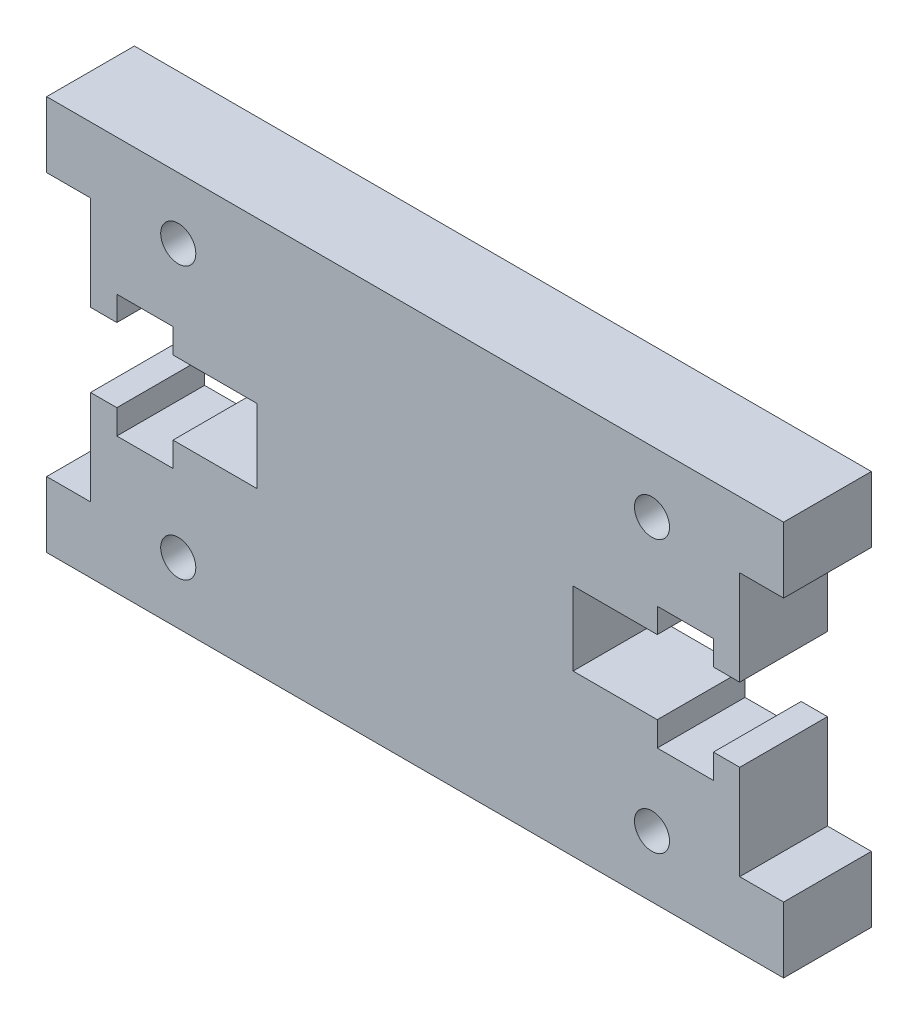
ISO-10303-21;
HEADER;
FILE_DESCRIPTION(('STEP AP214'),'2;1');
FILE_NAME('part.step','',(''),(''),'','','');
FILE_SCHEMA(('AUTOMOTIVE_DESIGN { 1 0 10303 214 1 1 1 1 }'));
ENDSEC;
DATA;
#1=APPLICATION_CONTEXT('core data for automotive mechanical design processes');
#2=APPLICATION_PROTOCOL_DEFINITION('international standard','automotive_design',2000,#1);
#3=PRODUCT_CONTEXT('',#1,'mechanical');
#4=PRODUCT('Part','Part','',(#3));
#5=PRODUCT_RELATED_PRODUCT_CATEGORY('part','',(#4));
#6=PRODUCT_DEFINITION_FORMATION('','',#4);
#7=PRODUCT_DEFINITION_CONTEXT('part definition',#1,'design');
#8=PRODUCT_DEFINITION('design','',#6,#7);
#9=PRODUCT_DEFINITION_SHAPE('','',#8);
#10=(LENGTH_UNIT() NAMED_UNIT(*) SI_UNIT(.MILLI.,.METRE.));
#11=(NAMED_UNIT(*) PLANE_ANGLE_UNIT() SI_UNIT($,.RADIAN.));
#12=(NAMED_UNIT(*) SI_UNIT($,.STERADIAN.) SOLID_ANGLE_UNIT());
#13=UNCERTAINTY_MEASURE_WITH_UNIT(LENGTH_MEASURE(1.E-05),#10,'distance_accuracy_value','');
#14=(GEOMETRIC_REPRESENTATION_CONTEXT(3) GLOBAL_UNCERTAINTY_ASSIGNED_CONTEXT((#13)) GLOBAL_UNIT_ASSIGNED_CONTEXT((#10,
#11,#12)) REPRESENTATION_CONTEXT('',''));
#15=CARTESIAN_POINT('',(0.,0.,0.));
#16=DIRECTION('',(0.,0.,1.));
#17=DIRECTION('',(1.,0.,0.));
#18=AXIS2_PLACEMENT_3D('',#15,#16,#17);
#19=CARTESIAN_POINT('',(0.,18.75,5.));
#20=DIRECTION('',(0.,-1.,0.));
#21=DIRECTION('',(1.,0.,0.));
#22=AXIS2_PLACEMENT_3D('',#19,#20,#21);
#23=PLANE('',#22);
#24=DIRECTION('',(-1.,0.,0.));
#25=VECTOR('',#24,1.);
#26=CARTESIAN_POINT('',(0.,18.75,0.));
#27=LINE('',#26,#25);
#28=CARTESIAN_POINT('',(0.,18.75,0.));
#29=VERTEX_POINT('',#28);
#30=CARTESIAN_POINT('',(-2.5,18.75,0.));
#31=VERTEX_POINT('',#30);
#32=EDGE_CURVE('E484',#29,#31,#27,.T.);
#33=ORIENTED_EDGE('',*,*,#32,.F.);
#34=DIRECTION('',(0.,0.,-1.));
#35=VECTOR('',#34,1.);
#36=CARTESIAN_POINT('',(0.,18.75,5.));
#37=LINE('',#36,#35);
#38=CARTESIAN_POINT('',(0.,18.75,5.));
#39=VERTEX_POINT('',#38);
#40=EDGE_CURVE('E11',#39,#29,#37,.T.);
#41=ORIENTED_EDGE('',*,*,#40,.F.);
#42=DIRECTION('',(-1.,0.,0.));
#43=VECTOR('',#42,1.);
#44=CARTESIAN_POINT('',(0.,18.75,5.));
#45=LINE('',#44,#43);
#46=CARTESIAN_POINT('',(-2.5,18.75,5.));
#47=VERTEX_POINT('',#46);
#48=EDGE_CURVE('E375',#39,#47,#45,.T.);
#49=ORIENTED_EDGE('',*,*,#48,.T.);
#50=DIRECTION('',(0.,0.,-1.));
#51=VECTOR('',#50,1.);
#52=CARTESIAN_POINT('',(-2.5,18.75,5.));
#53=LINE('',#52,#51);
#54=EDGE_CURVE('E56',#47,#31,#53,.T.);
#55=ORIENTED_EDGE('',*,*,#54,.T.);
#56=EDGE_LOOP('',(#33,#41,#49,#55));
#57=FACE_BOUND('',#56,.T.);
#58=ADVANCED_FACE('F39',(#57),#23,.T.);
#59=CARTESIAN_POINT('',(0.,0.,5.));
#60=DIRECTION('',(-1.,0.,0.));
#61=DIRECTION('',(0.,0.,1.));
#62=AXIS2_PLACEMENT_3D('',#59,#60,#61);
#63=PLANE('',#62);
#64=DIRECTION('',(0.,1.,0.));
#65=VECTOR('',#64,1.);
#66=CARTESIAN_POINT('',(0.,0.,0.));
#67=LINE('',#66,#65);
#68=CARTESIAN_POINT('',(0.,22.5,0.));
#69=VERTEX_POINT('',#68);
#70=EDGE_CURVE('E481',#29,#69,#67,.T.);
#71=ORIENTED_EDGE('',*,*,#70,.T.);
#72=DIRECTION('',(0.,0.,-1.));
#73=VECTOR('',#72,1.);
#74=CARTESIAN_POINT('',(0.,22.5,5.));
#75=LINE('',#74,#73);
#76=CARTESIAN_POINT('',(0.,22.5,5.));
#77=VERTEX_POINT('',#76);
#78=EDGE_CURVE('E48',#77,#69,#75,.T.);
#79=ORIENTED_EDGE('',*,*,#78,.F.);
#80=DIRECTION('',(0.,1.,0.));
#81=VECTOR('',#80,1.);
#82=CARTESIAN_POINT('',(0.,0.,5.));
#83=LINE('',#82,#81);
#84=EDGE_CURVE('E372',#39,#77,#83,.T.);
#85=ORIENTED_EDGE('',*,*,#84,.F.);
#86=ORIENTED_EDGE('',*,*,#40,.T.);
#87=EDGE_LOOP('',(#71,#79,#85,#86));
#88=FACE_BOUND('',#87,.T.);
#89=ADVANCED_FACE('F482',(#88),#63,.F.);
#90=CARTESIAN_POINT('',(0.,22.5,5.));
#91=DIRECTION('',(0.,-1.,0.));
#92=DIRECTION('',(1.,0.,0.));
#93=AXIS2_PLACEMENT_3D('',#90,#91,#92);
#94=PLANE('',#93);
#95=DIRECTION('',(-1.,0.,0.));
#96=VECTOR('',#95,1.);
#97=CARTESIAN_POINT('',(0.,22.5,0.));
#98=LINE('',#97,#96);
#99=CARTESIAN_POINT('',(-42.,22.5,0.));
#100=VERTEX_POINT('',#99);
#101=EDGE_CURVE('E477',#69,#100,#98,.T.);
#102=ORIENTED_EDGE('',*,*,#101,.T.);
#103=DIRECTION('',(0.,0.,-1.));
#104=VECTOR('',#103,1.);
#105=CARTESIAN_POINT('',(-42.,22.5,5.));
#106=LINE('',#105,#104);
#107=CARTESIAN_POINT('',(-42.,22.5,5.));
#108=VERTEX_POINT('',#107);
#109=EDGE_CURVE('E469',#108,#100,#106,.T.);
#110=ORIENTED_EDGE('',*,*,#109,.F.);
#111=DIRECTION('',(-1.,0.,0.));
#112=VECTOR('',#111,1.);
#113=CARTESIAN_POINT('',(0.,22.5,5.));
#114=LINE('',#113,#112);
#115=EDGE_CURVE('E370',#77,#108,#114,.T.);
#116=ORIENTED_EDGE('',*,*,#115,.F.);
#117=ORIENTED_EDGE('',*,*,#78,.T.);
#118=EDGE_LOOP('',(#102,#110,#116,#117));
#119=FACE_BOUND('',#118,.T.);
#120=ADVANCED_FACE('F475',(#119),#94,.F.);
#121=CARTESIAN_POINT('',(-42.,0.,5.));
#122=DIRECTION('',(-1.,0.,0.));
#123=DIRECTION('',(0.,0.,1.));
#124=AXIS2_PLACEMENT_3D('',#121,#122,#123);
#125=PLANE('',#124);
#126=DIRECTION('',(0.,1.,0.));
#127=VECTOR('',#126,1.);
#128=CARTESIAN_POINT('',(-42.,0.,0.));
#129=LINE('',#128,#127);
#130=CARTESIAN_POINT('',(-42.,18.75,0.));
#131=VERTEX_POINT('',#130);
#132=EDGE_CURVE('E487',#131,#100,#129,.T.);
#133=ORIENTED_EDGE('',*,*,#132,.F.);
#134=DIRECTION('',(0.,0.,-1.));
#135=VECTOR('',#134,1.);
#136=CARTESIAN_POINT('',(-42.,18.75,5.));
#137=LINE('',#136,#135);
#138=CARTESIAN_POINT('',(-42.,18.75,5.));
#139=VERTEX_POINT('',#138);
#140=EDGE_CURVE('E467',#139,#131,#137,.T.);
#141=ORIENTED_EDGE('',*,*,#140,.F.);
#142=DIRECTION('',(0.,1.,0.));
#143=VECTOR('',#142,1.);
#144=CARTESIAN_POINT('',(-42.,0.,5.));
#145=LINE('',#144,#143);
#146=EDGE_CURVE('E367',#139,#108,#145,.T.);
#147=ORIENTED_EDGE('',*,*,#146,.T.);
#148=ORIENTED_EDGE('',*,*,#109,.T.);
#149=EDGE_LOOP('',(#133,#141,#147,#148));
#150=FACE_BOUND('',#149,.T.);
#151=ADVANCED_FACE('F614',(#150),#125,.T.);
#152=CARTESIAN_POINT('',(0.,18.7500000000001,5.));
#153=DIRECTION('',(0.,1.,0.));
#154=DIRECTION('',(-1.,0.,0.));
#155=AXIS2_PLACEMENT_3D('',#152,#153,#154);
#156=PLANE('',#155);
#157=DIRECTION('',(1.,0.,0.));
#158=VECTOR('',#157,1.);
#159=CARTESIAN_POINT('',(0.,18.7500000000001,0.));
#160=LINE('',#159,#158);
#161=CARTESIAN_POINT('',(-39.5,18.75,0.));
#162=VERTEX_POINT('',#161);
#163=EDGE_CURVE('E602',#131,#162,#160,.T.);
#164=ORIENTED_EDGE('',*,*,#163,.T.);
#165=DIRECTION('',(0.,0.,-1.));
#166=VECTOR('',#165,1.);
#167=CARTESIAN_POINT('',(-39.5,18.75,5.));
#168=LINE('',#167,#166);
#169=CARTESIAN_POINT('',(-39.5,18.75,5.));
#170=VERTEX_POINT('',#169);
#171=EDGE_CURVE('E464',#170,#162,#168,.T.);
#172=ORIENTED_EDGE('',*,*,#171,.F.);
#173=DIRECTION('',(1.,0.,0.));
#174=VECTOR('',#173,1.);
#175=CARTESIAN_POINT('',(0.,18.7500000000001,5.));
#176=LINE('',#175,#174);
#177=EDGE_CURVE('E364',#139,#170,#176,.T.);
#178=ORIENTED_EDGE('',*,*,#177,.F.);
#179=ORIENTED_EDGE('',*,*,#140,.T.);
#180=EDGE_LOOP('',(#164,#172,#178,#179));
#181=FACE_BOUND('',#180,.T.);
#182=ADVANCED_FACE('F724',(#181),#156,.F.);
#183=CARTESIAN_POINT('',(-39.5,0.,5.));
#184=DIRECTION('',(1.,0.,0.));
#185=DIRECTION('',(0.,1.,0.));
#186=AXIS2_PLACEMENT_3D('',#183,#184,#185);
#187=PLANE('',#186);
#188=DIRECTION('',(0.,-1.,0.));
#189=VECTOR('',#188,1.);
#190=CARTESIAN_POINT('',(-39.5,0.,0.));
#191=LINE('',#190,#189);
#192=CARTESIAN_POINT('',(-39.5,13.35,0.));
#193=VERTEX_POINT('',#192);
#194=EDGE_CURVE('E592',#162,#193,#191,.T.);
#195=ORIENTED_EDGE('',*,*,#194,.T.);
#196=DIRECTION('',(0.,0.,-1.));
#197=VECTOR('',#196,1.);
#198=CARTESIAN_POINT('',(-39.5,13.35,5.));
#199=LINE('',#198,#197);
#200=CARTESIAN_POINT('',(-39.5,13.35,5.));
#201=VERTEX_POINT('',#200);
#202=EDGE_CURVE('E461',#201,#193,#199,.T.);
#203=ORIENTED_EDGE('',*,*,#202,.F.);
#204=DIRECTION('',(0.,-1.,0.));
#205=VECTOR('',#204,1.);
#206=CARTESIAN_POINT('',(-39.5,0.,5.));
#207=LINE('',#206,#205);
#208=EDGE_CURVE('E361',#170,#201,#207,.T.);
#209=ORIENTED_EDGE('',*,*,#208,.F.);
#210=ORIENTED_EDGE('',*,*,#171,.T.);
#211=EDGE_LOOP('',(#195,#203,#209,#210));
#212=FACE_BOUND('',#211,.T.);
#213=ADVANCED_FACE('F693',(#212),#187,.F.);
#214=CARTESIAN_POINT('',(0.,13.35,5.));
#215=DIRECTION('',(0.,1.,0.));
#216=DIRECTION('',(-1.,0.,0.));
#217=AXIS2_PLACEMENT_3D('',#214,#215,#216);
#218=PLANE('',#217);
#219=DIRECTION('',(1.,0.,0.));
#220=VECTOR('',#219,1.);
#221=CARTESIAN_POINT('',(0.,13.35,0.));
#222=LINE('',#221,#220);
#223=CARTESIAN_POINT('',(-38.,13.35,0.));
#224=VERTEX_POINT('',#223);
#225=EDGE_CURVE('E601',#193,#224,#222,.T.);
#226=ORIENTED_EDGE('',*,*,#225,.T.);
#227=DIRECTION('',(0.,0.,-1.));
#228=VECTOR('',#227,1.);
#229=CARTESIAN_POINT('',(-38.,13.35,5.));
#230=LINE('',#229,#228);
#231=CARTESIAN_POINT('',(-38.,13.35,5.));
#232=VERTEX_POINT('',#231);
#233=EDGE_CURVE('E459',#232,#224,#230,.T.);
#234=ORIENTED_EDGE('',*,*,#233,.F.);
#235=DIRECTION('',(1.,0.,0.));
#236=VECTOR('',#235,1.);
#237=CARTESIAN_POINT('',(0.,13.35,5.));
#238=LINE('',#237,#236);
#239=EDGE_CURVE('E359',#201,#232,#238,.T.);
#240=ORIENTED_EDGE('',*,*,#239,.F.);
#241=ORIENTED_EDGE('',*,*,#202,.T.);
#242=EDGE_LOOP('',(#226,#234,#240,#241));
#243=FACE_BOUND('',#242,.T.);
#244=ADVANCED_FACE('F720',(#243),#218,.F.);
#245=CARTESIAN_POINT('',(-38.,0.,5.));
#246=DIRECTION('',(1.,0.,0.));
#247=DIRECTION('',(0.,0.,-1.));
#248=AXIS2_PLACEMENT_3D('',#245,#246,#247);
#249=PLANE('',#248);
#250=DIRECTION('',(0.,-1.,0.));
#251=VECTOR('',#250,1.);
#252=CARTESIAN_POINT('',(-38.,0.,0.));
#253=LINE('',#252,#251);
#254=CARTESIAN_POINT('',(-38.,14.75,0.));
#255=VERTEX_POINT('',#254);
#256=EDGE_CURVE('E606',#255,#224,#253,.T.);
#257=ORIENTED_EDGE('',*,*,#256,.F.);
#258=DIRECTION('',(0.,0.,-1.));
#259=VECTOR('',#258,1.);
#260=CARTESIAN_POINT('',(-38.,14.75,5.));
#261=LINE('',#260,#259);
#262=CARTESIAN_POINT('',(-38.,14.75,5.));
#263=VERTEX_POINT('',#262);
#264=EDGE_CURVE('E457',#263,#255,#261,.T.);
#265=ORIENTED_EDGE('',*,*,#264,.F.);
#266=DIRECTION('',(0.,-1.,0.));
#267=VECTOR('',#266,1.);
#268=CARTESIAN_POINT('',(-38.,0.,5.));
#269=LINE('',#268,#267);
#270=EDGE_CURVE('E356',#263,#232,#269,.T.);
#271=ORIENTED_EDGE('',*,*,#270,.T.);
#272=ORIENTED_EDGE('',*,*,#233,.T.);
#273=EDGE_LOOP('',(#257,#265,#271,#272));
#274=FACE_BOUND('',#273,.T.);
#275=ADVANCED_FACE('F703',(#274),#249,.T.);
#276=CARTESIAN_POINT('',(0.,14.75,5.));
#277=DIRECTION('',(0.,-1.,0.));
#278=DIRECTION('',(0.,0.,-1.));
#279=AXIS2_PLACEMENT_3D('',#276,#277,#278);
#280=PLANE('',#279);
#281=DIRECTION('',(-1.,0.,0.));
#282=VECTOR('',#281,1.);
#283=CARTESIAN_POINT('',(0.,14.75,0.));
#284=LINE('',#283,#282);
#285=CARTESIAN_POINT('',(-34.8,14.75,0.));
#286=VERTEX_POINT('',#285);
#287=EDGE_CURVE('E1015',#286,#255,#284,.T.);
#288=ORIENTED_EDGE('',*,*,#287,.F.);
#289=DIRECTION('',(0.,0.,-1.));
#290=VECTOR('',#289,1.);
#291=CARTESIAN_POINT('',(-34.8,14.75,5.));
#292=LINE('',#291,#290);
#293=CARTESIAN_POINT('',(-34.8,14.75,5.));
#294=VERTEX_POINT('',#293);
#295=EDGE_CURVE('E455',#294,#286,#292,.T.);
#296=ORIENTED_EDGE('',*,*,#295,.F.);
#297=DIRECTION('',(-1.,0.,0.));
#298=VECTOR('',#297,1.);
#299=CARTESIAN_POINT('',(0.,14.75,5.));
#300=LINE('',#299,#298);
#301=EDGE_CURVE('E353',#294,#263,#300,.T.);
#302=ORIENTED_EDGE('',*,*,#301,.T.);
#303=ORIENTED_EDGE('',*,*,#264,.T.);
#304=EDGE_LOOP('',(#288,#296,#302,#303));
#305=FACE_BOUND('',#304,.T.);
#306=ADVANCED_FACE('F721',(#305),#280,.T.);
#307=CARTESIAN_POINT('',(-34.8,0.,5.));
#308=DIRECTION('',(1.,0.,0.));
#309=DIRECTION('',(0.,0.,-1.));
#310=AXIS2_PLACEMENT_3D('',#307,#308,#309);
#311=PLANE('',#310);
#312=DIRECTION('',(0.,-1.,0.));
#313=VECTOR('',#312,1.);
#314=CARTESIAN_POINT('',(-34.8,0.,0.));
#315=LINE('',#314,#313);
#316=CARTESIAN_POINT('',(-34.8,13.35,0.));
#317=VERTEX_POINT('',#316);
#318=EDGE_CURVE('E1006',#286,#317,#315,.T.);
#319=ORIENTED_EDGE('',*,*,#318,.T.);
#320=DIRECTION('',(0.,0.,-1.));
#321=VECTOR('',#320,1.);
#322=CARTESIAN_POINT('',(-34.8,13.35,5.));
#323=LINE('',#322,#321);
#324=CARTESIAN_POINT('',(-34.8,13.35,5.));
#325=VERTEX_POINT('',#324);
#326=EDGE_CURVE('E452',#325,#317,#323,.T.);
#327=ORIENTED_EDGE('',*,*,#326,.F.);
#328=DIRECTION('',(0.,-1.,0.));
#329=VECTOR('',#328,1.);
#330=CARTESIAN_POINT('',(-34.8,0.,5.));
#331=LINE('',#330,#329);
#332=EDGE_CURVE('E350',#294,#325,#331,.T.);
#333=ORIENTED_EDGE('',*,*,#332,.F.);
#334=ORIENTED_EDGE('',*,*,#295,.T.);
#335=EDGE_LOOP('',(#319,#327,#333,#334));
#336=FACE_BOUND('',#335,.T.);
#337=ADVANCED_FACE('F711',(#336),#311,.F.);
#338=CARTESIAN_POINT('',(-30.,13.35,0.));
#339=VERTEX_POINT('',#338);
#340=EDGE_CURVE('E607',#317,#339,#222,.T.);
#341=ORIENTED_EDGE('',*,*,#340,.T.);
#342=DIRECTION('',(0.,0.,-1.));
#343=VECTOR('',#342,1.);
#344=CARTESIAN_POINT('',(-30.,13.35,5.));
#345=LINE('',#344,#343);
#346=CARTESIAN_POINT('',(-30.,13.35,5.));
#347=VERTEX_POINT('',#346);
#348=EDGE_CURVE('E449',#347,#339,#345,.T.);
#349=ORIENTED_EDGE('',*,*,#348,.F.);
#350=EDGE_CURVE('E349',#325,#347,#238,.T.);
#351=ORIENTED_EDGE('',*,*,#350,.F.);
#352=ORIENTED_EDGE('',*,*,#326,.T.);
#353=EDGE_LOOP('',(#341,#349,#351,#352));
#354=FACE_BOUND('',#353,.T.);
#355=ADVANCED_FACE('F715',(#354),#218,.F.);
#356=CARTESIAN_POINT('',(-30.,0.,5.));
#357=DIRECTION('',(1.,0.,0.));
#358=DIRECTION('',(0.,0.,-1.));
#359=AXIS2_PLACEMENT_3D('',#356,#357,#358);
#360=PLANE('',#359);
#361=DIRECTION('',(0.,-1.,0.));
#362=VECTOR('',#361,1.);
#363=CARTESIAN_POINT('',(-30.,0.,0.));
#364=LINE('',#363,#362);
#365=CARTESIAN_POINT('',(-30.,9.15,0.));
#366=VERTEX_POINT('',#365);
#367=EDGE_CURVE('E1002',#339,#366,#364,.T.);
#368=ORIENTED_EDGE('',*,*,#367,.T.);
#369=DIRECTION('',(0.,0.,-1.));
#370=VECTOR('',#369,1.);
#371=CARTESIAN_POINT('',(-30.,9.15,5.));
#372=LINE('',#371,#370);
#373=CARTESIAN_POINT('',(-30.,9.15,5.));
#374=VERTEX_POINT('',#373);
#375=EDGE_CURVE('E447',#374,#366,#372,.T.);
#376=ORIENTED_EDGE('',*,*,#375,.F.);
#377=DIRECTION('',(0.,-1.,0.));
#378=VECTOR('',#377,1.);
#379=CARTESIAN_POINT('',(-30.,0.,5.));
#380=LINE('',#379,#378);
#381=EDGE_CURVE('E346',#347,#374,#380,.T.);
#382=ORIENTED_EDGE('',*,*,#381,.F.);
#383=ORIENTED_EDGE('',*,*,#348,.T.);
#384=EDGE_LOOP('',(#368,#376,#382,#383));
#385=FACE_BOUND('',#384,.T.);
#386=ADVANCED_FACE('F712',(#385),#360,.F.);
#387=CARTESIAN_POINT('',(0.,9.15000000000001,5.));
#388=DIRECTION('',(0.,1.,0.));
#389=DIRECTION('',(-1.,0.,0.));
#390=AXIS2_PLACEMENT_3D('',#387,#388,#389);
#391=PLANE('',#390);
#392=DIRECTION('',(1.,0.,0.));
#393=VECTOR('',#392,1.);
#394=CARTESIAN_POINT('',(0.,9.15000000000001,0.));
#395=LINE('',#394,#393);
#396=CARTESIAN_POINT('',(-34.8,9.15,0.));
#397=VERTEX_POINT('',#396);
#398=EDGE_CURVE('E597',#397,#366,#395,.T.);
#399=ORIENTED_EDGE('',*,*,#398,.F.);
#400=DIRECTION('',(0.,0.,-1.));
#401=VECTOR('',#400,1.);
#402=CARTESIAN_POINT('',(-34.8,9.15,5.));
#403=LINE('',#402,#401);
#404=CARTESIAN_POINT('',(-34.8,9.15,5.));
#405=VERTEX_POINT('',#404);
#406=EDGE_CURVE('E445',#405,#397,#403,.T.);
#407=ORIENTED_EDGE('',*,*,#406,.F.);
#408=DIRECTION('',(1.,0.,0.));
#409=VECTOR('',#408,1.);
#410=CARTESIAN_POINT('',(0.,9.15000000000001,5.));
#411=LINE('',#410,#409);
#412=EDGE_CURVE('E343',#405,#374,#411,.T.);
#413=ORIENTED_EDGE('',*,*,#412,.T.);
#414=ORIENTED_EDGE('',*,*,#375,.T.);
#415=EDGE_LOOP('',(#399,#407,#413,#414));
#416=FACE_BOUND('',#415,.T.);
#417=ADVANCED_FACE('F698',(#416),#391,.T.);
#418=CARTESIAN_POINT('',(-34.8,7.75,0.));
#419=VERTEX_POINT('',#418);
#420=EDGE_CURVE('E1001',#397,#419,#315,.T.);
#421=ORIENTED_EDGE('',*,*,#420,.T.);
#422=DIRECTION('',(0.,0.,-1.));
#423=VECTOR('',#422,1.);
#424=CARTESIAN_POINT('',(-34.8,7.75,5.));
#425=LINE('',#424,#423);
#426=CARTESIAN_POINT('',(-34.8,7.75,5.));
#427=VERTEX_POINT('',#426);
#428=EDGE_CURVE('E442',#427,#419,#425,.T.);
#429=ORIENTED_EDGE('',*,*,#428,.F.);
#430=EDGE_CURVE('E342',#405,#427,#331,.T.);
#431=ORIENTED_EDGE('',*,*,#430,.F.);
#432=ORIENTED_EDGE('',*,*,#406,.T.);
#433=EDGE_LOOP('',(#421,#429,#431,#432));
#434=FACE_BOUND('',#433,.T.);
#435=ADVANCED_FACE('F706',(#434),#311,.F.);
#436=CARTESIAN_POINT('',(0.,7.74999999999999,5.));
#437=DIRECTION('',(0.,-1.,0.));
#438=DIRECTION('',(1.,0.,0.));
#439=AXIS2_PLACEMENT_3D('',#436,#437,#438);
#440=PLANE('',#439);
#441=DIRECTION('',(-1.,0.,0.));
#442=VECTOR('',#441,1.);
#443=CARTESIAN_POINT('',(0.,7.74999999999999,0.));
#444=LINE('',#443,#442);
#445=CARTESIAN_POINT('',(-38.,7.75,0.));
#446=VERTEX_POINT('',#445);
#447=EDGE_CURVE('E1004',#419,#446,#444,.T.);
#448=ORIENTED_EDGE('',*,*,#447,.T.);
#449=DIRECTION('',(0.,0.,-1.));
#450=VECTOR('',#449,1.);
#451=CARTESIAN_POINT('',(-38.,7.75,5.));
#452=LINE('',#451,#450);
#453=CARTESIAN_POINT('',(-38.,7.75,5.));
#454=VERTEX_POINT('',#453);
#455=EDGE_CURVE('E440',#454,#446,#452,.T.);
#456=ORIENTED_EDGE('',*,*,#455,.F.);
#457=DIRECTION('',(-1.,0.,0.));
#458=VECTOR('',#457,1.);
#459=CARTESIAN_POINT('',(0.,7.74999999999999,5.));
#460=LINE('',#459,#458);
#461=EDGE_CURVE('E339',#427,#454,#460,.T.);
#462=ORIENTED_EDGE('',*,*,#461,.F.);
#463=ORIENTED_EDGE('',*,*,#428,.T.);
#464=EDGE_LOOP('',(#448,#456,#462,#463));
#465=FACE_BOUND('',#464,.T.);
#466=ADVANCED_FACE('F701',(#465),#440,.F.);
#467=CARTESIAN_POINT('',(-38.,9.15,0.));
#468=VERTEX_POINT('',#467);
#469=EDGE_CURVE('E595',#468,#446,#253,.T.);
#470=ORIENTED_EDGE('',*,*,#469,.F.);
#471=DIRECTION('',(0.,0.,-1.));
#472=VECTOR('',#471,1.);
#473=CARTESIAN_POINT('',(-38.,9.15,5.));
#474=LINE('',#473,#472);
#475=CARTESIAN_POINT('',(-38.,9.15,5.));
#476=VERTEX_POINT('',#475);
#477=EDGE_CURVE('E438',#476,#468,#474,.T.);
#478=ORIENTED_EDGE('',*,*,#477,.F.);
#479=EDGE_CURVE('E341',#476,#454,#269,.T.);
#480=ORIENTED_EDGE('',*,*,#479,.T.);
#481=ORIENTED_EDGE('',*,*,#455,.T.);
#482=EDGE_LOOP('',(#470,#478,#480,#481));
#483=FACE_BOUND('',#482,.T.);
#484=ADVANCED_FACE('F696',(#483),#249,.T.);
#485=CARTESIAN_POINT('',(-39.5,9.15,0.));
#486=VERTEX_POINT('',#485);
#487=EDGE_CURVE('E590',#486,#468,#395,.T.);
#488=ORIENTED_EDGE('',*,*,#487,.F.);
#489=DIRECTION('',(0.,0.,-1.));
#490=VECTOR('',#489,1.);
#491=CARTESIAN_POINT('',(-39.5,9.15,5.));
#492=LINE('',#491,#490);
#493=CARTESIAN_POINT('',(-39.5,9.15,5.));
#494=VERTEX_POINT('',#493);
#495=EDGE_CURVE('E436',#494,#486,#492,.T.);
#496=ORIENTED_EDGE('',*,*,#495,.F.);
#497=EDGE_CURVE('E347',#494,#476,#411,.T.);
#498=ORIENTED_EDGE('',*,*,#497,.T.);
#499=ORIENTED_EDGE('',*,*,#477,.T.);
#500=EDGE_LOOP('',(#488,#496,#498,#499));
#501=FACE_BOUND('',#500,.T.);
#502=ADVANCED_FACE('F692',(#501),#391,.T.);
#503=CARTESIAN_POINT('',(-39.5,3.75,0.));
#504=VERTEX_POINT('',#503);
#505=EDGE_CURVE('E587',#486,#504,#191,.T.);
#506=ORIENTED_EDGE('',*,*,#505,.T.);
#507=DIRECTION('',(0.,0.,-1.));
#508=VECTOR('',#507,1.);
#509=CARTESIAN_POINT('',(-39.5,3.75,5.));
#510=LINE('',#509,#508);
#511=CARTESIAN_POINT('',(-39.5,3.75,5.));
#512=VERTEX_POINT('',#511);
#513=EDGE_CURVE('E434',#512,#504,#510,.T.);
#514=ORIENTED_EDGE('',*,*,#513,.F.);
#515=EDGE_CURVE('E338',#494,#512,#207,.T.);
#516=ORIENTED_EDGE('',*,*,#515,.F.);
#517=ORIENTED_EDGE('',*,*,#495,.T.);
#518=EDGE_LOOP('',(#506,#514,#516,#517));
#519=FACE_BOUND('',#518,.T.);
#520=ADVANCED_FACE('F689',(#519),#187,.F.);
#521=CARTESIAN_POINT('',(0.,3.75,5.));
#522=DIRECTION('',(0.,1.,0.));
#523=DIRECTION('',(0.,0.,1.));
#524=AXIS2_PLACEMENT_3D('',#521,#522,#523);
#525=PLANE('',#524);
#526=DIRECTION('',(1.,0.,0.));
#527=VECTOR('',#526,1.);
#528=CARTESIAN_POINT('',(0.,3.75,0.));
#529=LINE('',#528,#527);
#530=CARTESIAN_POINT('',(-42.,3.75,0.));
#531=VERTEX_POINT('',#530);
#532=EDGE_CURVE('E504',#531,#504,#529,.T.);
#533=ORIENTED_EDGE('',*,*,#532,.F.);
#534=DIRECTION('',(0.,0.,-1.));
#535=VECTOR('',#534,1.);
#536=CARTESIAN_POINT('',(-42.,3.75,5.));
#537=LINE('',#536,#535);
#538=CARTESIAN_POINT('',(-42.,3.75,5.));
#539=VERTEX_POINT('',#538);
#540=EDGE_CURVE('E432',#539,#531,#537,.T.);
#541=ORIENTED_EDGE('',*,*,#540,.F.);
#542=DIRECTION('',(1.,0.,0.));
#543=VECTOR('',#542,1.);
#544=CARTESIAN_POINT('',(0.,3.75,5.));
#545=LINE('',#544,#543);
#546=EDGE_CURVE('E335',#539,#512,#545,.T.);
#547=ORIENTED_EDGE('',*,*,#546,.T.);
#548=ORIENTED_EDGE('',*,*,#513,.T.);
#549=EDGE_LOOP('',(#533,#541,#547,#548));
#550=FACE_BOUND('',#549,.T.);
#551=ADVANCED_FACE('F686',(#550),#525,.T.);
#552=CARTESIAN_POINT('',(-42.,0.,0.));
#553=VERTEX_POINT('',#552);
#554=EDGE_CURVE('E500',#553,#531,#129,.T.);
#555=ORIENTED_EDGE('',*,*,#554,.F.);
#556=DIRECTION('',(0.,0.,-1.));
#557=VECTOR('',#556,1.);
#558=CARTESIAN_POINT('',(-42.,0.,5.));
#559=LINE('',#558,#557);
#560=CARTESIAN_POINT('',(-42.,0.,5.));
#561=VERTEX_POINT('',#560);
#562=EDGE_CURVE('E430',#561,#553,#559,.T.);
#563=ORIENTED_EDGE('',*,*,#562,.F.);
#564=EDGE_CURVE('E334',#561,#539,#145,.T.);
#565=ORIENTED_EDGE('',*,*,#564,.T.);
#566=ORIENTED_EDGE('',*,*,#540,.T.);
#567=EDGE_LOOP('',(#555,#563,#565,#566));
#568=FACE_BOUND('',#567,.T.);
#569=ADVANCED_FACE('F581',(#568),#125,.T.);
#570=CARTESIAN_POINT('',(0.,0.,5.));
#571=DIRECTION('',(0.,-1.,0.));
#572=DIRECTION('',(1.,0.,0.));
#573=AXIS2_PLACEMENT_3D('',#570,#571,#572);
#574=PLANE('',#573);
#575=DIRECTION('',(-1.,0.,0.));
#576=VECTOR('',#575,1.);
#577=CARTESIAN_POINT('',(0.,0.,0.));
#578=LINE('',#577,#576);
#579=CARTESIAN_POINT('',(0.,0.,0.));
#580=VERTEX_POINT('',#579);
#581=EDGE_CURVE('E493',#580,#553,#578,.T.);
#582=ORIENTED_EDGE('',*,*,#581,.F.);
#583=DIRECTION('',(0.,0.,-1.));
#584=VECTOR('',#583,1.);
#585=CARTESIAN_POINT('',(0.,0.,5.));
#586=LINE('',#585,#584);
#587=CARTESIAN_POINT('',(0.,0.,5.));
#588=VERTEX_POINT('',#587);
#589=EDGE_CURVE('E428',#588,#580,#586,.T.);
#590=ORIENTED_EDGE('',*,*,#589,.F.);
#591=DIRECTION('',(-1.,0.,0.));
#592=VECTOR('',#591,1.);
#593=CARTESIAN_POINT('',(0.,0.,5.));
#594=LINE('',#593,#592);
#595=EDGE_CURVE('E331',#588,#561,#594,.T.);
#596=ORIENTED_EDGE('',*,*,#595,.T.);
#597=ORIENTED_EDGE('',*,*,#562,.T.);
#598=EDGE_LOOP('',(#582,#590,#596,#597));
#599=FACE_BOUND('',#598,.T.);
#600=ADVANCED_FACE('F578',(#599),#574,.T.);
#601=CARTESIAN_POINT('',(0.,3.75,0.));
#602=VERTEX_POINT('',#601);
#603=EDGE_CURVE('E486',#580,#602,#67,.T.);
#604=ORIENTED_EDGE('',*,*,#603,.T.);
#605=DIRECTION('',(0.,0.,-1.));
#606=VECTOR('',#605,1.);
#607=CARTESIAN_POINT('',(0.,3.75,5.));
#608=LINE('',#607,#606);
#609=CARTESIAN_POINT('',(0.,3.75,5.));
#610=VERTEX_POINT('',#609);
#611=EDGE_CURVE('E425',#610,#602,#608,.T.);
#612=ORIENTED_EDGE('',*,*,#611,.F.);
#613=EDGE_CURVE('E330',#588,#610,#83,.T.);
#614=ORIENTED_EDGE('',*,*,#613,.F.);
#615=ORIENTED_EDGE('',*,*,#589,.T.);
#616=EDGE_LOOP('',(#604,#612,#614,#615));
#617=FACE_BOUND('',#616,.T.);
#618=ADVANCED_FACE('F572',(#617),#63,.F.);
#619=CARTESIAN_POINT('',(0.,3.75,5.));
#620=DIRECTION('',(0.,-1.,0.));
#621=DIRECTION('',(1.,0.,0.));
#622=AXIS2_PLACEMENT_3D('',#619,#620,#621);
#623=PLANE('',#622);
#624=DIRECTION('',(-1.,0.,0.));
#625=VECTOR('',#624,1.);
#626=CARTESIAN_POINT('',(0.,3.75,0.));
#627=LINE('',#626,#625);
#628=CARTESIAN_POINT('',(-2.5,3.75,0.));
#629=VERTEX_POINT('',#628);
#630=EDGE_CURVE('E492',#602,#629,#627,.T.);
#631=ORIENTED_EDGE('',*,*,#630,.T.);
#632=DIRECTION('',(0.,0.,-1.));
#633=VECTOR('',#632,1.);
#634=CARTESIAN_POINT('',(-2.5,3.75,5.));
#635=LINE('',#634,#633);
#636=CARTESIAN_POINT('',(-2.5,3.75,5.));
#637=VERTEX_POINT('',#636);
#638=EDGE_CURVE('E423',#637,#629,#635,.T.);
#639=ORIENTED_EDGE('',*,*,#638,.F.);
#640=DIRECTION('',(-1.,0.,0.));
#641=VECTOR('',#640,1.);
#642=CARTESIAN_POINT('',(0.,3.75,5.));
#643=LINE('',#642,#641);
#644=EDGE_CURVE('E328',#610,#637,#643,.T.);
#645=ORIENTED_EDGE('',*,*,#644,.F.);
#646=ORIENTED_EDGE('',*,*,#611,.T.);
#647=EDGE_LOOP('',(#631,#639,#645,#646));
#648=FACE_BOUND('',#647,.T.);
#649=ADVANCED_FACE('F569',(#648),#623,.F.);
#650=CARTESIAN_POINT('',(-2.5,0.,5.));
#651=DIRECTION('',(1.,0.,0.));
#652=DIRECTION('',(0.,1.,0.));
#653=AXIS2_PLACEMENT_3D('',#650,#651,#652);
#654=PLANE('',#653);
#655=DIRECTION('',(0.,-1.,0.));
#656=VECTOR('',#655,1.);
#657=CARTESIAN_POINT('',(-2.5,0.,0.));
#658=LINE('',#657,#656);
#659=CARTESIAN_POINT('',(-2.5,9.15,0.));
#660=VERTEX_POINT('',#659);
#661=EDGE_CURVE('E396',#660,#629,#658,.T.);
#662=ORIENTED_EDGE('',*,*,#661,.F.);
#663=DIRECTION('',(0.,0.,-1.));
#664=VECTOR('',#663,1.);
#665=CARTESIAN_POINT('',(-2.5,9.15,5.));
#666=LINE('',#665,#664);
#667=CARTESIAN_POINT('',(-2.5,9.15,5.));
#668=VERTEX_POINT('',#667);
#669=EDGE_CURVE('E421',#668,#660,#666,.T.);
#670=ORIENTED_EDGE('',*,*,#669,.F.);
#671=DIRECTION('',(0.,-1.,0.));
#672=VECTOR('',#671,1.);
#673=CARTESIAN_POINT('',(-2.5,0.,5.));
#674=LINE('',#673,#672);
#675=EDGE_CURVE('E304',#668,#637,#674,.T.);
#676=ORIENTED_EDGE('',*,*,#675,.T.);
#677=ORIENTED_EDGE('',*,*,#638,.T.);
#678=EDGE_LOOP('',(#662,#670,#676,#677));
#679=FACE_BOUND('',#678,.T.);
#680=ADVANCED_FACE('F566',(#679),#654,.T.);
#681=CARTESIAN_POINT('',(0.,9.15,5.));
#682=DIRECTION('',(0.,-1.,0.));
#683=DIRECTION('',(1.,0.,0.));
#684=AXIS2_PLACEMENT_3D('',#681,#682,#683);
#685=PLANE('',#684);
#686=DIRECTION('',(-1.,0.,0.));
#687=VECTOR('',#686,1.);
#688=CARTESIAN_POINT('',(0.,9.15,0.));
#689=LINE('',#688,#687);
#690=CARTESIAN_POINT('',(-3.99999999999999,9.15,0.));
#691=VERTEX_POINT('',#690);
#692=EDGE_CURVE('E510',#660,#691,#689,.T.);
#693=ORIENTED_EDGE('',*,*,#692,.T.);
#694=DIRECTION('',(0.,0.,-1.));
#695=VECTOR('',#694,1.);
#696=CARTESIAN_POINT('',(-3.99999999999999,9.15,5.));
#697=LINE('',#696,#695);
#698=CARTESIAN_POINT('',(-3.99999999999999,9.15,5.));
#699=VERTEX_POINT('',#698);
#700=EDGE_CURVE('E418',#699,#691,#697,.T.);
#701=ORIENTED_EDGE('',*,*,#700,.F.);
#702=DIRECTION('',(-1.,0.,0.));
#703=VECTOR('',#702,1.);
#704=CARTESIAN_POINT('',(0.,9.15,5.));
#705=LINE('',#704,#703);
#706=EDGE_CURVE('E320',#668,#699,#705,.T.);
#707=ORIENTED_EDGE('',*,*,#706,.F.);
#708=ORIENTED_EDGE('',*,*,#669,.T.);
#709=EDGE_LOOP('',(#693,#701,#707,#708));
#710=FACE_BOUND('',#709,.T.);
#711=ADVANCED_FACE('F563',(#710),#685,.F.);
#712=CARTESIAN_POINT('',(-3.99999999999999,0.,5.));
#713=DIRECTION('',(1.,0.,0.));
#714=DIRECTION('',(0.,0.,-1.));
#715=AXIS2_PLACEMENT_3D('',#712,#713,#714);
#716=PLANE('',#715);
#717=DIRECTION('',(0.,-1.,0.));
#718=VECTOR('',#717,1.);
#719=CARTESIAN_POINT('',(-3.99999999999999,0.,0.));
#720=LINE('',#719,#718);
#721=CARTESIAN_POINT('',(-3.99999999999999,7.75,0.));
#722=VERTEX_POINT('',#721);
#723=EDGE_CURVE('E513',#691,#722,#720,.T.);
#724=ORIENTED_EDGE('',*,*,#723,.T.);
#725=DIRECTION('',(0.,0.,-1.));
#726=VECTOR('',#725,1.);
#727=CARTESIAN_POINT('',(-3.99999999999999,7.75,5.));
#728=LINE('',#727,#726);
#729=CARTESIAN_POINT('',(-3.99999999999999,7.75,5.));
#730=VERTEX_POINT('',#729);
#731=EDGE_CURVE('E416',#730,#722,#728,.T.);
#732=ORIENTED_EDGE('',*,*,#731,.F.);
#733=DIRECTION('',(0.,-1.,0.));
#734=VECTOR('',#733,1.);
#735=CARTESIAN_POINT('',(-3.99999999999999,0.,5.));
#736=LINE('',#735,#734);
#737=EDGE_CURVE('E289',#699,#730,#736,.T.);
#738=ORIENTED_EDGE('',*,*,#737,.F.);
#739=ORIENTED_EDGE('',*,*,#700,.T.);
#740=EDGE_LOOP('',(#724,#732,#738,#739));
#741=FACE_BOUND('',#740,.T.);
#742=ADVANCED_FACE('F560',(#741),#716,.F.);
#743=CARTESIAN_POINT('',(0.,7.75,5.));
#744=DIRECTION('',(0.,1.,0.));
#745=DIRECTION('',(-1.,0.,0.));
#746=AXIS2_PLACEMENT_3D('',#743,#744,#745);
#747=PLANE('',#746);
#748=DIRECTION('',(1.,0.,0.));
#749=VECTOR('',#748,1.);
#750=CARTESIAN_POINT('',(0.,7.75,0.));
#751=LINE('',#750,#749);
#752=CARTESIAN_POINT('',(-7.19999999999999,7.75,0.));
#753=VERTEX_POINT('',#752);
#754=EDGE_CURVE('E517',#753,#722,#751,.T.);
#755=ORIENTED_EDGE('',*,*,#754,.F.);
#756=DIRECTION('',(0.,0.,-1.));
#757=VECTOR('',#756,1.);
#758=CARTESIAN_POINT('',(-7.19999999999999,7.75,5.));
#759=LINE('',#758,#757);
#760=CARTESIAN_POINT('',(-7.19999999999999,7.75,5.));
#761=VERTEX_POINT('',#760);
#762=EDGE_CURVE('E414',#761,#753,#759,.T.);
#763=ORIENTED_EDGE('',*,*,#762,.F.);
#764=DIRECTION('',(1.,0.,0.));
#765=VECTOR('',#764,1.);
#766=CARTESIAN_POINT('',(0.,7.75,5.));
#767=LINE('',#766,#765);
#768=EDGE_CURVE('E323',#761,#730,#767,.T.);
#769=ORIENTED_EDGE('',*,*,#768,.T.);
#770=ORIENTED_EDGE('',*,*,#731,.T.);
#771=EDGE_LOOP('',(#755,#763,#769,#770));
#772=FACE_BOUND('',#771,.T.);
#773=ADVANCED_FACE('F554',(#772),#747,.T.);
#774=CARTESIAN_POINT('',(-7.19999999999999,0.,5.));
#775=DIRECTION('',(1.,0.,0.));
#776=DIRECTION('',(0.,0.,-1.));
#777=AXIS2_PLACEMENT_3D('',#774,#775,#776);
#778=PLANE('',#777);
#779=DIRECTION('',(0.,-1.,0.));
#780=VECTOR('',#779,1.);
#781=CARTESIAN_POINT('',(-7.19999999999999,0.,0.));
#782=LINE('',#781,#780);
#783=CARTESIAN_POINT('',(-7.19999999999999,9.15,0.));
#784=VERTEX_POINT('',#783);
#785=EDGE_CURVE('E520',#784,#753,#782,.T.);
#786=ORIENTED_EDGE('',*,*,#785,.F.);
#787=DIRECTION('',(0.,0.,-1.));
#788=VECTOR('',#787,1.);
#789=CARTESIAN_POINT('',(-7.19999999999999,9.15,5.));
#790=LINE('',#789,#788);
#791=CARTESIAN_POINT('',(-7.19999999999999,9.15,5.));
#792=VERTEX_POINT('',#791);
#793=EDGE_CURVE('E412',#792,#784,#790,.T.);
#794=ORIENTED_EDGE('',*,*,#793,.F.);
#795=DIRECTION('',(0.,-1.,0.));
#796=VECTOR('',#795,1.);
#797=CARTESIAN_POINT('',(-7.19999999999999,0.,5.));
#798=LINE('',#797,#796);
#799=EDGE_CURVE('E314',#792,#761,#798,.T.);
#800=ORIENTED_EDGE('',*,*,#799,.T.);
#801=ORIENTED_EDGE('',*,*,#762,.T.);
#802=EDGE_LOOP('',(#786,#794,#800,#801));
#803=FACE_BOUND('',#802,.T.);
#804=ADVANCED_FACE('F548',(#803),#778,.T.);
#805=CARTESIAN_POINT('',(-12.,9.15,0.));
#806=VERTEX_POINT('',#805);
#807=EDGE_CURVE('E514',#784,#806,#689,.T.);
#808=ORIENTED_EDGE('',*,*,#807,.T.);
#809=DIRECTION('',(0.,0.,-1.));
#810=VECTOR('',#809,1.);
#811=CARTESIAN_POINT('',(-12.,9.15,5.));
#812=LINE('',#811,#810);
#813=CARTESIAN_POINT('',(-12.,9.15,5.));
#814=VERTEX_POINT('',#813);
#815=EDGE_CURVE('E410',#814,#806,#812,.T.);
#816=ORIENTED_EDGE('',*,*,#815,.F.);
#817=EDGE_CURVE('E316',#792,#814,#705,.T.);
#818=ORIENTED_EDGE('',*,*,#817,.F.);
#819=ORIENTED_EDGE('',*,*,#793,.T.);
#820=EDGE_LOOP('',(#808,#816,#818,#819));
#821=FACE_BOUND('',#820,.T.);
#822=ADVANCED_FACE('F674',(#821),#685,.F.);
#823=CARTESIAN_POINT('',(-12.,0.,5.));
#824=DIRECTION('',(1.,0.,0.));
#825=DIRECTION('',(0.,0.,-1.));
#826=AXIS2_PLACEMENT_3D('',#823,#824,#825);
#827=PLANE('',#826);
#828=DIRECTION('',(0.,-1.,0.));
#829=VECTOR('',#828,1.);
#830=CARTESIAN_POINT('',(-12.,0.,0.));
#831=LINE('',#830,#829);
#832=CARTESIAN_POINT('',(-12.,13.35,0.));
#833=VERTEX_POINT('',#832);
#834=EDGE_CURVE('E524',#833,#806,#831,.T.);
#835=ORIENTED_EDGE('',*,*,#834,.F.);
#836=DIRECTION('',(0.,0.,-1.));
#837=VECTOR('',#836,1.);
#838=CARTESIAN_POINT('',(-12.,13.35,5.));
#839=LINE('',#838,#837);
#840=CARTESIAN_POINT('',(-12.,13.35,5.));
#841=VERTEX_POINT('',#840);
#842=EDGE_CURVE('E408',#841,#833,#839,.T.);
#843=ORIENTED_EDGE('',*,*,#842,.F.);
#844=DIRECTION('',(0.,-1.,0.));
#845=VECTOR('',#844,1.);
#846=CARTESIAN_POINT('',(-12.,0.,5.));
#847=LINE('',#846,#845);
#848=EDGE_CURVE('E309',#841,#814,#847,.T.);
#849=ORIENTED_EDGE('',*,*,#848,.T.);
#850=ORIENTED_EDGE('',*,*,#815,.T.);
#851=EDGE_LOOP('',(#835,#843,#849,#850));
#852=FACE_BOUND('',#851,.T.);
#853=ADVANCED_FACE('F541',(#852),#827,.T.);
#854=CARTESIAN_POINT('',(0.,13.35,5.));
#855=DIRECTION('',(0.,-1.,0.));
#856=DIRECTION('',(1.,0.,0.));
#857=AXIS2_PLACEMENT_3D('',#854,#855,#856);
#858=PLANE('',#857);
#859=DIRECTION('',(-1.,0.,0.));
#860=VECTOR('',#859,1.);
#861=CARTESIAN_POINT('',(0.,13.35,0.));
#862=LINE('',#861,#860);
#863=CARTESIAN_POINT('',(-7.19999999999999,13.35,0.));
#864=VERTEX_POINT('',#863);
#865=EDGE_CURVE('E526',#864,#833,#862,.T.);
#866=ORIENTED_EDGE('',*,*,#865,.F.);
#867=DIRECTION('',(0.,0.,-1.));
#868=VECTOR('',#867,1.);
#869=CARTESIAN_POINT('',(-7.19999999999999,13.35,5.));
#870=LINE('',#869,#868);
#871=CARTESIAN_POINT('',(-7.19999999999999,13.35,5.));
#872=VERTEX_POINT('',#871);
#873=EDGE_CURVE('E406',#872,#864,#870,.T.);
#874=ORIENTED_EDGE('',*,*,#873,.F.);
#875=DIRECTION('',(-1.,0.,0.));
#876=VECTOR('',#875,1.);
#877=CARTESIAN_POINT('',(0.,13.35,5.));
#878=LINE('',#877,#876);
#879=EDGE_CURVE('E301',#872,#841,#878,.T.);
#880=ORIENTED_EDGE('',*,*,#879,.T.);
#881=ORIENTED_EDGE('',*,*,#842,.T.);
#882=EDGE_LOOP('',(#866,#874,#880,#881));
#883=FACE_BOUND('',#882,.T.);
#884=ADVANCED_FACE('F539',(#883),#858,.T.);
#885=CARTESIAN_POINT('',(-7.19999999999999,14.75,0.));
#886=VERTEX_POINT('',#885);
#887=EDGE_CURVE('E523',#886,#864,#782,.T.);
#888=ORIENTED_EDGE('',*,*,#887,.F.);
#889=DIRECTION('',(0.,0.,-1.));
#890=VECTOR('',#889,1.);
#891=CARTESIAN_POINT('',(-7.19999999999999,14.75,5.));
#892=LINE('',#891,#890);
#893=CARTESIAN_POINT('',(-7.19999999999999,14.75,5.));
#894=VERTEX_POINT('',#893);
#895=EDGE_CURVE('E404',#894,#886,#892,.T.);
#896=ORIENTED_EDGE('',*,*,#895,.F.);
#897=EDGE_CURVE('E308',#894,#872,#798,.T.);
#898=ORIENTED_EDGE('',*,*,#897,.T.);
#899=ORIENTED_EDGE('',*,*,#873,.T.);
#900=EDGE_LOOP('',(#888,#896,#898,#899));
#901=FACE_BOUND('',#900,.T.);
#902=ADVANCED_FACE('F538',(#901),#778,.T.);
#903=CARTESIAN_POINT('',(0.,14.75,5.));
#904=DIRECTION('',(0.,1.,0.));
#905=DIRECTION('',(-1.,0.,0.));
#906=AXIS2_PLACEMENT_3D('',#903,#904,#905);
#907=PLANE('',#906);
#908=DIRECTION('',(1.,0.,0.));
#909=VECTOR('',#908,1.);
#910=CARTESIAN_POINT('',(0.,14.75,0.));
#911=LINE('',#910,#909);
#912=CARTESIAN_POINT('',(-3.99999999999999,14.75,0.));
#913=VERTEX_POINT('',#912);
#914=EDGE_CURVE('E399',#886,#913,#911,.T.);
#915=ORIENTED_EDGE('',*,*,#914,.T.);
#916=DIRECTION('',(0.,0.,-1.));
#917=VECTOR('',#916,1.);
#918=CARTESIAN_POINT('',(-3.99999999999999,14.75,5.));
#919=LINE('',#918,#917);
#920=CARTESIAN_POINT('',(-3.99999999999999,14.75,5.));
#921=VERTEX_POINT('',#920);
#922=EDGE_CURVE('E296',#921,#913,#919,.T.);
#923=ORIENTED_EDGE('',*,*,#922,.F.);
#924=DIRECTION('',(1.,0.,0.));
#925=VECTOR('',#924,1.);
#926=CARTESIAN_POINT('',(0.,14.75,5.));
#927=LINE('',#926,#925);
#928=EDGE_CURVE('E284',#894,#921,#927,.T.);
#929=ORIENTED_EDGE('',*,*,#928,.F.);
#930=ORIENTED_EDGE('',*,*,#895,.T.);
#931=EDGE_LOOP('',(#915,#923,#929,#930));
#932=FACE_BOUND('',#931,.T.);
#933=ADVANCED_FACE('F533',(#932),#907,.F.);
#934=CARTESIAN_POINT('',(-3.99999999999999,13.35,0.));
#935=VERTEX_POINT('',#934);
#936=EDGE_CURVE('E293',#913,#935,#720,.T.);
#937=ORIENTED_EDGE('',*,*,#936,.T.);
#938=DIRECTION('',(0.,0.,-1.));
#939=VECTOR('',#938,1.);
#940=CARTESIAN_POINT('',(-3.99999999999999,13.35,5.));
#941=LINE('',#940,#939);
#942=CARTESIAN_POINT('',(-3.99999999999999,13.35,5.));
#943=VERTEX_POINT('',#942);
#944=EDGE_CURVE('E291',#943,#935,#941,.T.);
#945=ORIENTED_EDGE('',*,*,#944,.F.);
#946=EDGE_CURVE('E274',#921,#943,#736,.T.);
#947=ORIENTED_EDGE('',*,*,#946,.F.);
#948=ORIENTED_EDGE('',*,*,#922,.T.);
#949=EDGE_LOOP('',(#937,#945,#947,#948));
#950=FACE_BOUND('',#949,.T.);
#951=ADVANCED_FACE('F292',(#950),#716,.F.);
#952=CARTESIAN_POINT('',(-2.5,13.35,0.));
#953=VERTEX_POINT('',#952);
#954=EDGE_CURVE('E394',#953,#935,#862,.T.);
#955=ORIENTED_EDGE('',*,*,#954,.F.);
#956=DIRECTION('',(0.,0.,-1.));
#957=VECTOR('',#956,1.);
#958=CARTESIAN_POINT('',(-2.5,13.35,5.));
#959=LINE('',#958,#957);
#960=CARTESIAN_POINT('',(-2.5,13.35,5.));
#961=VERTEX_POINT('',#960);
#962=EDGE_CURVE('E165',#961,#953,#959,.T.);
#963=ORIENTED_EDGE('',*,*,#962,.F.);
#964=EDGE_CURVE('E281',#961,#943,#878,.T.);
#965=ORIENTED_EDGE('',*,*,#964,.T.);
#966=ORIENTED_EDGE('',*,*,#944,.T.);
#967=EDGE_LOOP('',(#955,#963,#965,#966));
#968=FACE_BOUND('',#967,.T.);
#969=ADVANCED_FACE('F298',(#968),#858,.T.);
#970=EDGE_CURVE('E389',#31,#953,#658,.T.);
#971=ORIENTED_EDGE('',*,*,#970,.F.);
#972=ORIENTED_EDGE('',*,*,#54,.F.);
#973=EDGE_CURVE('E299',#47,#961,#674,.T.);
#974=ORIENTED_EDGE('',*,*,#973,.T.);
#975=ORIENTED_EDGE('',*,*,#962,.T.);
#976=EDGE_LOOP('',(#971,#972,#974,#975));
#977=FACE_BOUND('',#976,.T.);
#978=ADVANCED_FACE('F629',(#977),#654,.T.);
#979=CARTESIAN_POINT('',(-34.5,19.,5.));
#980=DIRECTION('',(0.,0.,-1.));
#981=DIRECTION('',(-1.,0.,0.));
#982=AXIS2_PLACEMENT_3D('',#979,#980,#981);
#983=CYLINDRICAL_SURFACE('',#982,0.999999999999998);
#984=CARTESIAN_POINT('',(-34.5,19.,5.));
#985=DIRECTION('',(0.,0.,1.));
#986=DIRECTION('',(1.,0.,0.));
#987=AXIS2_PLACEMENT_3D('',#984,#985,#986);
#988=CIRCLE('',#987,0.999999999999998);
#989=CARTESIAN_POINT('',(-33.5,19.,5.));
#990=VERTEX_POINT('',#989);
#991=EDGE_CURVE('E377',#990,#990,#988,.T.);
#992=ORIENTED_EDGE('',*,*,#991,.T.);
#993=EDGE_LOOP('',(#992));
#994=FACE_BOUND('',#993,.T.);
#995=CARTESIAN_POINT('',(-34.5,19.,0.));
#996=DIRECTION('',(0.,0.,1.));
#997=DIRECTION('',(1.,0.,0.));
#998=AXIS2_PLACEMENT_3D('',#995,#996,#997);
#999=CIRCLE('',#998,0.999999999999998);
#1000=CARTESIAN_POINT('',(-33.5,19.,0.));
#1001=VERTEX_POINT('',#1000);
#1002=EDGE_CURVE('E489',#1001,#1001,#999,.T.);
#1003=ORIENTED_EDGE('',*,*,#1002,.F.);
#1004=EDGE_LOOP('',(#1003));
#1005=FACE_BOUND('',#1004,.T.);
#1006=ADVANCED_FACE('F626',(#994,#1005),#983,.F.);
#1007=CARTESIAN_POINT('',(-7.5,19.,5.));
#1008=DIRECTION('',(0.,0.,-1.));
#1009=DIRECTION('',(-1.,0.,0.));
#1010=AXIS2_PLACEMENT_3D('',#1007,#1008,#1009);
#1011=CYLINDRICAL_SURFACE('',#1010,1.);
#1012=CARTESIAN_POINT('',(-7.5,19.,5.));
#1013=DIRECTION('',(0.,0.,1.));
#1014=DIRECTION('',(1.,0.,0.));
#1015=AXIS2_PLACEMENT_3D('',#1012,#1013,#1014);
#1016=CIRCLE('',#1015,1.);
#1017=CARTESIAN_POINT('',(-6.5,19.,5.));
#1018=VERTEX_POINT('',#1017);
#1019=EDGE_CURVE('E380',#1018,#1018,#1016,.T.);
#1020=ORIENTED_EDGE('',*,*,#1019,.T.);
#1021=EDGE_LOOP('',(#1020));
#1022=FACE_BOUND('',#1021,.T.);
#1023=CARTESIAN_POINT('',(-7.5,19.,0.));
#1024=DIRECTION('',(0.,0.,1.));
#1025=DIRECTION('',(1.,0.,0.));
#1026=AXIS2_PLACEMENT_3D('',#1023,#1024,#1025);
#1027=CIRCLE('',#1026,1.);
#1028=CARTESIAN_POINT('',(-6.5,19.,0.));
#1029=VERTEX_POINT('',#1028);
#1030=EDGE_CURVE('E642',#1029,#1029,#1027,.T.);
#1031=ORIENTED_EDGE('',*,*,#1030,.F.);
#1032=EDGE_LOOP('',(#1031));
#1033=FACE_BOUND('',#1032,.T.);
#1034=ADVANCED_FACE('F628',(#1022,#1033),#1011,.F.);
#1035=CARTESIAN_POINT('',(-7.50000000000001,3.5,5.));
#1036=DIRECTION('',(0.,0.,-1.));
#1037=DIRECTION('',(-1.,0.,0.));
#1038=AXIS2_PLACEMENT_3D('',#1035,#1036,#1037);
#1039=CYLINDRICAL_SURFACE('',#1038,1.);
#1040=CARTESIAN_POINT('',(-7.50000000000001,3.5,5.));
#1041=DIRECTION('',(0.,0.,1.));
#1042=DIRECTION('',(1.,0.,0.));
#1043=AXIS2_PLACEMENT_3D('',#1040,#1041,#1042);
#1044=CIRCLE('',#1043,1.);
#1045=CARTESIAN_POINT('',(-6.50000000000001,3.5,5.));
#1046=VERTEX_POINT('',#1045);
#1047=EDGE_CURVE('E383',#1046,#1046,#1044,.F.);
#1048=ORIENTED_EDGE('',*,*,#1047,.F.);
#1049=EDGE_LOOP('',(#1048));
#1050=FACE_BOUND('',#1049,.T.);
#1051=CARTESIAN_POINT('',(-7.50000000000001,3.5,0.));
#1052=DIRECTION('',(0.,0.,1.));
#1053=DIRECTION('',(1.,0.,0.));
#1054=AXIS2_PLACEMENT_3D('',#1051,#1052,#1053);
#1055=CIRCLE('',#1054,1.);
#1056=CARTESIAN_POINT('',(-6.50000000000001,3.5,0.));
#1057=VERTEX_POINT('',#1056);
#1058=EDGE_CURVE('E644',#1057,#1057,#1055,.F.);
#1059=ORIENTED_EDGE('',*,*,#1058,.T.);
#1060=EDGE_LOOP('',(#1059));
#1061=FACE_BOUND('',#1060,.T.);
#1062=ADVANCED_FACE('F41',(#1050,#1061),#1039,.F.);
#1063=CARTESIAN_POINT('',(-34.5,3.5,5.));
#1064=DIRECTION('',(0.,0.,-1.));
#1065=DIRECTION('',(-1.,0.,0.));
#1066=AXIS2_PLACEMENT_3D('',#1063,#1064,#1065);
#1067=CYLINDRICAL_SURFACE('',#1066,0.999999999999998);
#1068=CARTESIAN_POINT('',(-34.5,3.5,5.));
#1069=DIRECTION('',(0.,0.,1.));
#1070=DIRECTION('',(1.,0.,0.));
#1071=AXIS2_PLACEMENT_3D('',#1068,#1069,#1070);
#1072=CIRCLE('',#1071,0.999999999999998);
#1073=CARTESIAN_POINT('',(-33.5,3.5,5.));
#1074=VERTEX_POINT('',#1073);
#1075=EDGE_CURVE('E302',#1074,#1074,#1072,.F.);
#1076=ORIENTED_EDGE('',*,*,#1075,.F.);
#1077=EDGE_LOOP('',(#1076));
#1078=FACE_BOUND('',#1077,.T.);
#1079=CARTESIAN_POINT('',(-34.5,3.5,0.));
#1080=DIRECTION('',(0.,0.,1.));
#1081=DIRECTION('',(1.,0.,0.));
#1082=AXIS2_PLACEMENT_3D('',#1079,#1080,#1081);
#1083=CIRCLE('',#1082,0.999999999999998);
#1084=CARTESIAN_POINT('',(-33.5,3.5,0.));
#1085=VERTEX_POINT('',#1084);
#1086=EDGE_CURVE('E385',#1085,#1085,#1083,.F.);
#1087=ORIENTED_EDGE('',*,*,#1086,.T.);
#1088=EDGE_LOOP('',(#1087));
#1089=FACE_BOUND('',#1088,.T.);
#1090=ADVANCED_FACE('F636',(#1078,#1089),#1067,.F.);
#1091=CARTESIAN_POINT('',(0.,0.,5.));
#1092=DIRECTION('',(0.,0.,1.));
#1093=DIRECTION('',(1.,0.,0.));
#1094=AXIS2_PLACEMENT_3D('',#1091,#1092,#1093);
#1095=PLANE('',#1094);
#1096=ORIENTED_EDGE('',*,*,#1047,.T.);
#1097=EDGE_LOOP('',(#1096));
#1098=FACE_BOUND('',#1097,.T.);
#1099=ORIENTED_EDGE('',*,*,#1019,.F.);
#1100=EDGE_LOOP('',(#1099));
#1101=FACE_BOUND('',#1100,.T.);
#1102=ORIENTED_EDGE('',*,*,#991,.F.);
#1103=EDGE_LOOP('',(#1102));
#1104=FACE_BOUND('',#1103,.T.);
#1105=ORIENTED_EDGE('',*,*,#48,.F.);
#1106=ORIENTED_EDGE('',*,*,#84,.T.);
#1107=ORIENTED_EDGE('',*,*,#115,.T.);
#1108=ORIENTED_EDGE('',*,*,#146,.F.);
#1109=ORIENTED_EDGE('',*,*,#177,.T.);
#1110=ORIENTED_EDGE('',*,*,#208,.T.);
#1111=ORIENTED_EDGE('',*,*,#239,.T.);
#1112=ORIENTED_EDGE('',*,*,#270,.F.);
#1113=ORIENTED_EDGE('',*,*,#301,.F.);
#1114=ORIENTED_EDGE('',*,*,#332,.T.);
#1115=ORIENTED_EDGE('',*,*,#350,.T.);
#1116=ORIENTED_EDGE('',*,*,#381,.T.);
#1117=ORIENTED_EDGE('',*,*,#412,.F.);
#1118=ORIENTED_EDGE('',*,*,#430,.T.);
#1119=ORIENTED_EDGE('',*,*,#461,.T.);
#1120=ORIENTED_EDGE('',*,*,#479,.F.);
#1121=ORIENTED_EDGE('',*,*,#497,.F.);
#1122=ORIENTED_EDGE('',*,*,#515,.T.);
#1123=ORIENTED_EDGE('',*,*,#546,.F.);
#1124=ORIENTED_EDGE('',*,*,#564,.F.);
#1125=ORIENTED_EDGE('',*,*,#595,.F.);
#1126=ORIENTED_EDGE('',*,*,#613,.T.);
#1127=ORIENTED_EDGE('',*,*,#644,.T.);
#1128=ORIENTED_EDGE('',*,*,#675,.F.);
#1129=ORIENTED_EDGE('',*,*,#706,.T.);
#1130=ORIENTED_EDGE('',*,*,#737,.T.);
#1131=ORIENTED_EDGE('',*,*,#768,.F.);
#1132=ORIENTED_EDGE('',*,*,#799,.F.);
#1133=ORIENTED_EDGE('',*,*,#817,.T.);
#1134=ORIENTED_EDGE('',*,*,#848,.F.);
#1135=ORIENTED_EDGE('',*,*,#879,.F.);
#1136=ORIENTED_EDGE('',*,*,#897,.F.);
#1137=ORIENTED_EDGE('',*,*,#928,.T.);
#1138=ORIENTED_EDGE('',*,*,#946,.T.);
#1139=ORIENTED_EDGE('',*,*,#964,.F.);
#1140=ORIENTED_EDGE('',*,*,#973,.F.);
#1141=EDGE_LOOP('',(#1105,#1106,#1107,#1108,#1109,#1110,#1111,#1112,#1113,#1114,#1115,#1116,
#1117,#1118,#1119,#1120,#1121,#1122,#1123,#1124,#1125,#1126,#1127,#1128,#1129,#1130,#1131,#1132,
#1133,#1134,#1135,#1136,#1137,#1138,#1139,#1140));
#1142=FACE_BOUND('',#1141,.T.);
#1143=ORIENTED_EDGE('',*,*,#1075,.T.);
#1144=EDGE_LOOP('',(#1143));
#1145=FACE_BOUND('',#1144,.T.);
#1146=ADVANCED_FACE('F277',(#1098,#1101,#1104,#1142,#1145),#1095,.T.);
#1147=CARTESIAN_POINT('',(0.,0.,0.));
#1148=DIRECTION('',(0.,0.,1.));
#1149=DIRECTION('',(1.,0.,0.));
#1150=AXIS2_PLACEMENT_3D('',#1147,#1148,#1149);
#1151=PLANE('',#1150);
#1152=ORIENTED_EDGE('',*,*,#1058,.F.);
#1153=EDGE_LOOP('',(#1152));
#1154=FACE_BOUND('',#1153,.T.);
#1155=ORIENTED_EDGE('',*,*,#1030,.T.);
#1156=EDGE_LOOP('',(#1155));
#1157=FACE_BOUND('',#1156,.T.);
#1158=ORIENTED_EDGE('',*,*,#1002,.T.);
#1159=EDGE_LOOP('',(#1158));
#1160=FACE_BOUND('',#1159,.T.);
#1161=ORIENTED_EDGE('',*,*,#32,.T.);
#1162=ORIENTED_EDGE('',*,*,#970,.T.);
#1163=ORIENTED_EDGE('',*,*,#954,.T.);
#1164=ORIENTED_EDGE('',*,*,#936,.F.);
#1165=ORIENTED_EDGE('',*,*,#914,.F.);
#1166=ORIENTED_EDGE('',*,*,#887,.T.);
#1167=ORIENTED_EDGE('',*,*,#865,.T.);
#1168=ORIENTED_EDGE('',*,*,#834,.T.);
#1169=ORIENTED_EDGE('',*,*,#807,.F.);
#1170=ORIENTED_EDGE('',*,*,#785,.T.);
#1171=ORIENTED_EDGE('',*,*,#754,.T.);
#1172=ORIENTED_EDGE('',*,*,#723,.F.);
#1173=ORIENTED_EDGE('',*,*,#692,.F.);
#1174=ORIENTED_EDGE('',*,*,#661,.T.);
#1175=ORIENTED_EDGE('',*,*,#630,.F.);
#1176=ORIENTED_EDGE('',*,*,#603,.F.);
#1177=ORIENTED_EDGE('',*,*,#581,.T.);
#1178=ORIENTED_EDGE('',*,*,#554,.T.);
#1179=ORIENTED_EDGE('',*,*,#532,.T.);
#1180=ORIENTED_EDGE('',*,*,#505,.F.);
#1181=ORIENTED_EDGE('',*,*,#487,.T.);
#1182=ORIENTED_EDGE('',*,*,#469,.T.);
#1183=ORIENTED_EDGE('',*,*,#447,.F.);
#1184=ORIENTED_EDGE('',*,*,#420,.F.);
#1185=ORIENTED_EDGE('',*,*,#398,.T.);
#1186=ORIENTED_EDGE('',*,*,#367,.F.);
#1187=ORIENTED_EDGE('',*,*,#340,.F.);
#1188=ORIENTED_EDGE('',*,*,#318,.F.);
#1189=ORIENTED_EDGE('',*,*,#287,.T.);
#1190=ORIENTED_EDGE('',*,*,#256,.T.);
#1191=ORIENTED_EDGE('',*,*,#225,.F.);
#1192=ORIENTED_EDGE('',*,*,#194,.F.);
#1193=ORIENTED_EDGE('',*,*,#163,.F.);
#1194=ORIENTED_EDGE('',*,*,#132,.T.);
#1195=ORIENTED_EDGE('',*,*,#101,.F.);
#1196=ORIENTED_EDGE('',*,*,#70,.F.);
#1197=EDGE_LOOP('',(#1161,#1162,#1163,#1164,#1165,#1166,#1167,#1168,#1169,#1170,#1171,#1172,
#1173,#1174,#1175,#1176,#1177,#1178,#1179,#1180,#1181,#1182,#1183,#1184,#1185,#1186,#1187,#1188,
#1189,#1190,#1191,#1192,#1193,#1194,#1195,#1196));
#1198=FACE_BOUND('',#1197,.T.);
#1199=ORIENTED_EDGE('',*,*,#1086,.F.);
#1200=EDGE_LOOP('',(#1199));
#1201=FACE_BOUND('',#1200,.T.);
#1202=ADVANCED_FACE('F535',(#1154,#1157,#1160,#1198,#1201),#1151,.F.);
#1203=CLOSED_SHELL('',(#58,#89,#120,#151,#182,#213,#244,#275,#306,#337,#355,#386,#417,#435,#466,
#484,#502,#520,#551,#569,#600,#618,#649,#680,#711,#742,#773,#804,#822,#853,#884,#902,#933,#951,
#969,#978,#1006,#1034,#1062,#1090,#1146,#1202));
#1204=MANIFOLD_SOLID_BREP('B2',#1203);
#1205=ADVANCED_BREP_SHAPE_REPRESENTATION('',(#18,#1204),#14);
#1206=SHAPE_DEFINITION_REPRESENTATION(#9,#1205);
ENDSEC;
END-ISO-10303-21;
